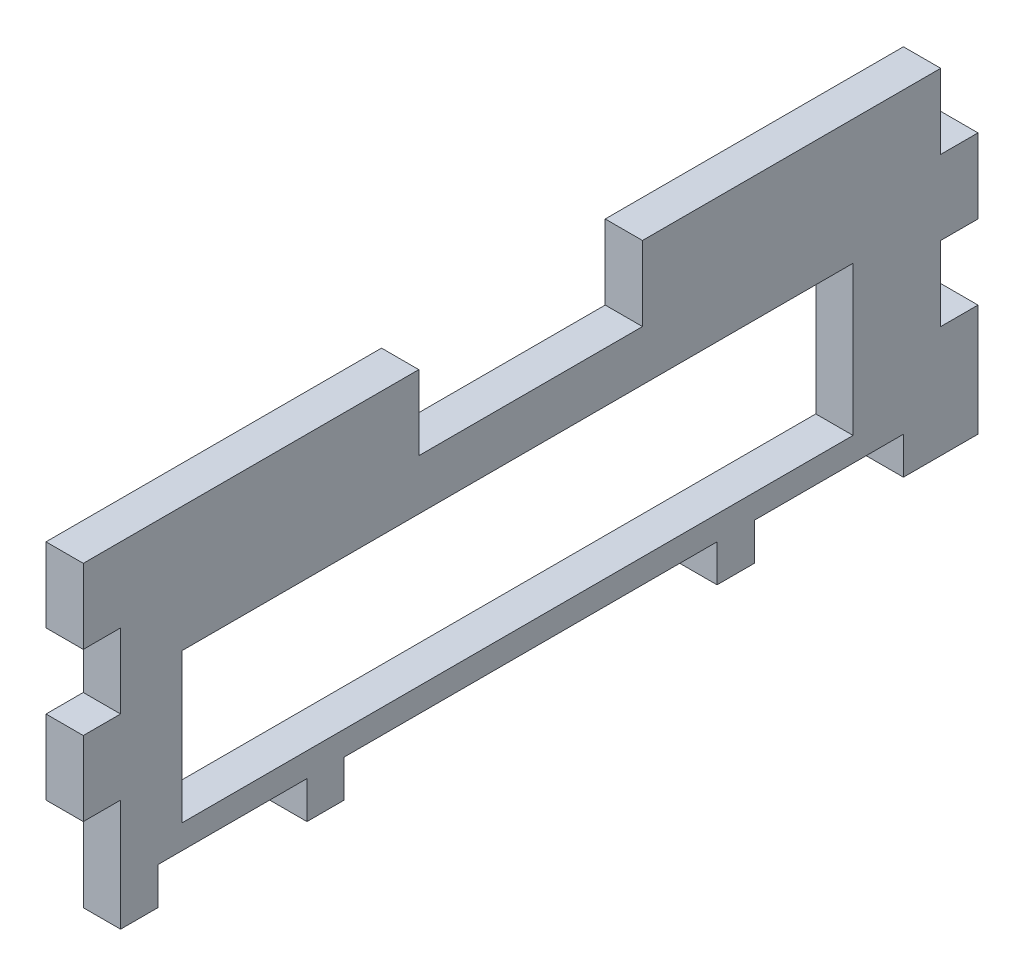
ISO-10303-21;
HEADER;
FILE_DESCRIPTION(('STEP AP214'),'2;1');
FILE_NAME('part.step','',(''),(''),'','','');
FILE_SCHEMA(('AUTOMOTIVE_DESIGN { 1 0 10303 214 1 1 1 1 }'));
ENDSEC;
DATA;
#1=APPLICATION_CONTEXT('core data for automotive mechanical design processes');
#2=APPLICATION_PROTOCOL_DEFINITION('international standard','automotive_design',2000,#1);
#3=PRODUCT_CONTEXT('',#1,'mechanical');
#4=PRODUCT('Part','Part','',(#3));
#5=PRODUCT_RELATED_PRODUCT_CATEGORY('part','',(#4));
#6=PRODUCT_DEFINITION_FORMATION('','',#4);
#7=PRODUCT_DEFINITION_CONTEXT('part definition',#1,'design');
#8=PRODUCT_DEFINITION('design','',#6,#7);
#9=PRODUCT_DEFINITION_SHAPE('','',#8);
#10=(LENGTH_UNIT() NAMED_UNIT(*) SI_UNIT(.MILLI.,.METRE.));
#11=(NAMED_UNIT(*) PLANE_ANGLE_UNIT() SI_UNIT($,.RADIAN.));
#12=(NAMED_UNIT(*) SI_UNIT($,.STERADIAN.) SOLID_ANGLE_UNIT());
#13=UNCERTAINTY_MEASURE_WITH_UNIT(LENGTH_MEASURE(1.E-05),#10,'distance_accuracy_value','');
#14=(GEOMETRIC_REPRESENTATION_CONTEXT(3) GLOBAL_UNCERTAINTY_ASSIGNED_CONTEXT((#13)) GLOBAL_UNIT_ASSIGNED_CONTEXT((#10,
#11,#12)) REPRESENTATION_CONTEXT('',''));
#15=CARTESIAN_POINT('',(0.,0.,0.));
#16=DIRECTION('',(0.,0.,1.));
#17=DIRECTION('',(1.,0.,0.));
#18=AXIS2_PLACEMENT_3D('',#15,#16,#17);
#19=CARTESIAN_POINT('',(6.35,4.10720563576842,0.));
#20=DIRECTION('',(0.,1.,0.));
#21=DIRECTION('',(0.,0.,1.));
#22=AXIS2_PLACEMENT_3D('',#19,#20,#21);
#23=PLANE('',#22);
#24=DIRECTION('',(0.,0.,-1.));
#25=VECTOR('',#24,1.);
#26=CARTESIAN_POINT('',(0.,4.10720563576842,0.));
#27=LINE('',#26,#25);
#28=CARTESIAN_POINT('',(0.,4.10720563576842,59.381703523286));
#29=VERTEX_POINT('',#28);
#30=CARTESIAN_POINT('',(0.,4.10720563576842,-54.918296476714));
#31=VERTEX_POINT('',#30);
#32=EDGE_CURVE('E373',#29,#31,#27,.T.);
#33=ORIENTED_EDGE('',*,*,#32,.T.);
#34=DIRECTION('',(-1.,0.,0.));
#35=VECTOR('',#34,1.);
#36=CARTESIAN_POINT('',(6.35,4.10720563576842,-54.918296476714));
#37=LINE('',#36,#35);
#38=CARTESIAN_POINT('',(6.35,4.10720563576842,-54.918296476714));
#39=VERTEX_POINT('',#38);
#40=EDGE_CURVE('E11',#39,#31,#37,.T.);
#41=ORIENTED_EDGE('',*,*,#40,.F.);
#42=DIRECTION('',(0.,0.,-1.));
#43=VECTOR('',#42,1.);
#44=CARTESIAN_POINT('',(6.35,4.10720563576842,0.));
#45=LINE('',#44,#43);
#46=CARTESIAN_POINT('',(6.35,4.10720563576842,59.381703523286));
#47=VERTEX_POINT('',#46);
#48=EDGE_CURVE('E280',#47,#39,#45,.T.);
#49=ORIENTED_EDGE('',*,*,#48,.F.);
#50=DIRECTION('',(-1.,0.,0.));
#51=VECTOR('',#50,1.);
#52=CARTESIAN_POINT('',(6.35,4.10720563576842,59.381703523286));
#53=LINE('',#52,#51);
#54=EDGE_CURVE('E54',#47,#29,#53,.T.);
#55=ORIENTED_EDGE('',*,*,#54,.T.);
#56=EDGE_LOOP('',(#33,#41,#49,#55));
#57=FACE_BOUND('',#56,.T.);
#58=ADVANCED_FACE('F35',(#57),#23,.F.);
#59=CARTESIAN_POINT('',(6.35,0.,-54.918296476714));
#60=DIRECTION('',(0.,0.,-1.));
#61=DIRECTION('',(-1.,0.,0.));
#62=AXIS2_PLACEMENT_3D('',#59,#60,#61);
#63=PLANE('',#62);
#64=DIRECTION('',(0.,-1.,0.));
#65=VECTOR('',#64,1.);
#66=CARTESIAN_POINT('',(0.,0.,-54.918296476714));
#67=LINE('',#66,#65);
#68=CARTESIAN_POINT('',(0.,-21.2927943642316,-54.918296476714));
#69=VERTEX_POINT('',#68);
#70=EDGE_CURVE('E286',#31,#69,#67,.T.);
#71=ORIENTED_EDGE('',*,*,#70,.T.);
#72=DIRECTION('',(-1.,0.,0.));
#73=VECTOR('',#72,1.);
#74=CARTESIAN_POINT('',(6.35,-21.2927943642316,-54.918296476714));
#75=LINE('',#74,#73);
#76=CARTESIAN_POINT('',(6.35,-21.2927943642316,-54.918296476714));
#77=VERTEX_POINT('',#76);
#78=EDGE_CURVE('E45',#77,#69,#75,.T.);
#79=ORIENTED_EDGE('',*,*,#78,.F.);
#80=DIRECTION('',(0.,-1.,0.));
#81=VECTOR('',#80,1.);
#82=CARTESIAN_POINT('',(6.35,0.,-54.918296476714));
#83=LINE('',#82,#81);
#84=EDGE_CURVE('E274',#39,#77,#83,.T.);
#85=ORIENTED_EDGE('',*,*,#84,.F.);
#86=ORIENTED_EDGE('',*,*,#40,.T.);
#87=EDGE_LOOP('',(#71,#79,#85,#86));
#88=FACE_BOUND('',#87,.T.);
#89=ADVANCED_FACE('F285',(#88),#63,.F.);
#90=CARTESIAN_POINT('',(6.35,-21.2927943642316,0.));
#91=DIRECTION('',(0.,1.,0.));
#92=DIRECTION('',(0.,0.,1.));
#93=AXIS2_PLACEMENT_3D('',#90,#91,#92);
#94=PLANE('',#93);
#95=DIRECTION('',(0.,0.,-1.));
#96=VECTOR('',#95,1.);
#97=CARTESIAN_POINT('',(0.,-21.2927943642316,0.));
#98=LINE('',#97,#96);
#99=CARTESIAN_POINT('',(0.,-21.2927943642316,59.381703523286));
#100=VERTEX_POINT('',#99);
#101=EDGE_CURVE('E376',#100,#69,#98,.T.);
#102=ORIENTED_EDGE('',*,*,#101,.F.);
#103=DIRECTION('',(-1.,0.,0.));
#104=VECTOR('',#103,1.);
#105=CARTESIAN_POINT('',(6.35,-21.2927943642316,59.381703523286));
#106=LINE('',#105,#104);
#107=CARTESIAN_POINT('',(6.35,-21.2927943642316,59.381703523286));
#108=VERTEX_POINT('',#107);
#109=EDGE_CURVE('E162',#108,#100,#106,.T.);
#110=ORIENTED_EDGE('',*,*,#109,.F.);
#111=DIRECTION('',(0.,0.,-1.));
#112=VECTOR('',#111,1.);
#113=CARTESIAN_POINT('',(6.35,-21.2927943642316,0.));
#114=LINE('',#113,#112);
#115=EDGE_CURVE('E279',#108,#77,#114,.T.);
#116=ORIENTED_EDGE('',*,*,#115,.T.);
#117=ORIENTED_EDGE('',*,*,#78,.T.);
#118=EDGE_LOOP('',(#102,#110,#116,#117));
#119=FACE_BOUND('',#118,.T.);
#120=ADVANCED_FACE('F290',(#119),#94,.T.);
#121=CARTESIAN_POINT('',(6.35,25.4,0.));
#122=DIRECTION('',(0.,1.,0.));
#123=DIRECTION('',(0.,0.,1.));
#124=AXIS2_PLACEMENT_3D('',#121,#122,#123);
#125=PLANE('',#124);
#126=DIRECTION('',(0.,0.,-1.));
#127=VECTOR('',#126,1.);
#128=CARTESIAN_POINT('',(0.,25.4,0.));
#129=LINE('',#128,#127);
#130=CARTESIAN_POINT('',(0.,25.4,-19.05));
#131=VERTEX_POINT('',#130);
#132=CARTESIAN_POINT('',(0.,25.4,-69.85));
#133=VERTEX_POINT('',#132);
#134=EDGE_CURVE('E297',#131,#133,#129,.T.);
#135=ORIENTED_EDGE('',*,*,#134,.F.);
#136=DIRECTION('',(-1.,0.,0.));
#137=VECTOR('',#136,1.);
#138=CARTESIAN_POINT('',(6.35,25.4,-19.05));
#139=LINE('',#138,#137);
#140=CARTESIAN_POINT('',(6.35,25.4,-19.05));
#141=VERTEX_POINT('',#140);
#142=EDGE_CURVE('E39',#141,#131,#139,.T.);
#143=ORIENTED_EDGE('',*,*,#142,.F.);
#144=DIRECTION('',(0.,0.,-1.));
#145=VECTOR('',#144,1.);
#146=CARTESIAN_POINT('',(6.35,25.4,0.));
#147=LINE('',#146,#145);
#148=CARTESIAN_POINT('',(6.35,25.4,-69.85));
#149=VERTEX_POINT('',#148);
#150=EDGE_CURVE('E381',#141,#149,#147,.T.);
#151=ORIENTED_EDGE('',*,*,#150,.T.);
#152=DIRECTION('',(-1.,0.,0.));
#153=VECTOR('',#152,1.);
#154=CARTESIAN_POINT('',(6.35,25.4,-69.85));
#155=LINE('',#154,#153);
#156=EDGE_CURVE('E293',#149,#133,#155,.T.);
#157=ORIENTED_EDGE('',*,*,#156,.T.);
#158=EDGE_LOOP('',(#135,#143,#151,#157));
#159=FACE_BOUND('',#158,.T.);
#160=ADVANCED_FACE('F467',(#159),#125,.T.);
#161=CARTESIAN_POINT('',(6.35,0.,-19.05));
#162=DIRECTION('',(0.,0.,-1.));
#163=DIRECTION('',(0.,1.,0.));
#164=AXIS2_PLACEMENT_3D('',#161,#162,#163);
#165=PLANE('',#164);
#166=DIRECTION('',(0.,-1.,0.));
#167=VECTOR('',#166,1.);
#168=CARTESIAN_POINT('',(0.,0.,-19.05));
#169=LINE('',#168,#167);
#170=CARTESIAN_POINT('',(0.,12.7,-19.05));
#171=VERTEX_POINT('',#170);
#172=EDGE_CURVE('E300',#131,#171,#169,.T.);
#173=ORIENTED_EDGE('',*,*,#172,.T.);
#174=DIRECTION('',(-1.,0.,0.));
#175=VECTOR('',#174,1.);
#176=CARTESIAN_POINT('',(6.35,12.7,-19.05));
#177=LINE('',#176,#175);
#178=CARTESIAN_POINT('',(6.35,12.7,-19.05));
#179=VERTEX_POINT('',#178);
#180=EDGE_CURVE('E452',#179,#171,#177,.T.);
#181=ORIENTED_EDGE('',*,*,#180,.F.);
#182=DIRECTION('',(0.,-1.,0.));
#183=VECTOR('',#182,1.);
#184=CARTESIAN_POINT('',(6.35,0.,-19.05));
#185=LINE('',#184,#183);
#186=EDGE_CURVE('E459',#141,#179,#185,.T.);
#187=ORIENTED_EDGE('',*,*,#186,.F.);
#188=ORIENTED_EDGE('',*,*,#142,.T.);
#189=EDGE_LOOP('',(#173,#181,#187,#188));
#190=FACE_BOUND('',#189,.T.);
#191=ADVANCED_FACE('F37',(#190),#165,.F.);
#192=CARTESIAN_POINT('',(6.35,12.7,0.));
#193=DIRECTION('',(0.,1.,0.));
#194=DIRECTION('',(0.,0.,1.));
#195=AXIS2_PLACEMENT_3D('',#192,#193,#194);
#196=PLANE('',#195);
#197=DIRECTION('',(0.,0.,-1.));
#198=VECTOR('',#197,1.);
#199=CARTESIAN_POINT('',(0.,12.7,0.));
#200=LINE('',#199,#198);
#201=CARTESIAN_POINT('',(0.,12.7,19.05));
#202=VERTEX_POINT('',#201);
#203=EDGE_CURVE('E305',#202,#171,#200,.T.);
#204=ORIENTED_EDGE('',*,*,#203,.F.);
#205=DIRECTION('',(-1.,0.,0.));
#206=VECTOR('',#205,1.);
#207=CARTESIAN_POINT('',(6.35,12.7,19.05));
#208=LINE('',#207,#206);
#209=CARTESIAN_POINT('',(6.35,12.7,19.05));
#210=VERTEX_POINT('',#209);
#211=EDGE_CURVE('E451',#210,#202,#208,.T.);
#212=ORIENTED_EDGE('',*,*,#211,.F.);
#213=DIRECTION('',(0.,0.,-1.));
#214=VECTOR('',#213,1.);
#215=CARTESIAN_POINT('',(6.35,12.7,0.));
#216=LINE('',#215,#214);
#217=EDGE_CURVE('E521',#210,#179,#216,.T.);
#218=ORIENTED_EDGE('',*,*,#217,.T.);
#219=ORIENTED_EDGE('',*,*,#180,.T.);
#220=EDGE_LOOP('',(#204,#212,#218,#219));
#221=FACE_BOUND('',#220,.T.);
#222=ADVANCED_FACE('F675',(#221),#196,.T.);
#223=CARTESIAN_POINT('',(6.35,0.,19.05));
#224=DIRECTION('',(0.,0.,-1.));
#225=DIRECTION('',(-1.,0.,0.));
#226=AXIS2_PLACEMENT_3D('',#223,#224,#225);
#227=PLANE('',#226);
#228=DIRECTION('',(0.,-1.,0.));
#229=VECTOR('',#228,1.);
#230=CARTESIAN_POINT('',(0.,0.,19.05));
#231=LINE('',#230,#229);
#232=CARTESIAN_POINT('',(0.,25.4,19.05));
#233=VERTEX_POINT('',#232);
#234=EDGE_CURVE('E308',#233,#202,#231,.T.);
#235=ORIENTED_EDGE('',*,*,#234,.F.);
#236=DIRECTION('',(-1.,0.,0.));
#237=VECTOR('',#236,1.);
#238=CARTESIAN_POINT('',(6.35,25.4,19.05));
#239=LINE('',#238,#237);
#240=CARTESIAN_POINT('',(6.35,25.4,19.05));
#241=VERTEX_POINT('',#240);
#242=EDGE_CURVE('E449',#241,#233,#239,.T.);
#243=ORIENTED_EDGE('',*,*,#242,.F.);
#244=DIRECTION('',(0.,-1.,0.));
#245=VECTOR('',#244,1.);
#246=CARTESIAN_POINT('',(6.35,0.,19.05));
#247=LINE('',#246,#245);
#248=EDGE_CURVE('E523',#241,#210,#247,.T.);
#249=ORIENTED_EDGE('',*,*,#248,.T.);
#250=ORIENTED_EDGE('',*,*,#211,.T.);
#251=EDGE_LOOP('',(#235,#243,#249,#250));
#252=FACE_BOUND('',#251,.T.);
#253=ADVANCED_FACE('F672',(#252),#227,.T.);
#254=CARTESIAN_POINT('',(0.,25.4,76.2));
#255=VERTEX_POINT('',#254);
#256=EDGE_CURVE('E302',#255,#233,#129,.T.);
#257=ORIENTED_EDGE('',*,*,#256,.F.);
#258=DIRECTION('',(-1.,0.,0.));
#259=VECTOR('',#258,1.);
#260=CARTESIAN_POINT('',(6.35,25.4,76.2));
#261=LINE('',#260,#259);
#262=CARTESIAN_POINT('',(6.35,25.4,76.2));
#263=VERTEX_POINT('',#262);
#264=EDGE_CURVE('E447',#263,#255,#261,.T.);
#265=ORIENTED_EDGE('',*,*,#264,.F.);
#266=EDGE_CURVE('E519',#263,#241,#147,.T.);
#267=ORIENTED_EDGE('',*,*,#266,.T.);
#268=ORIENTED_EDGE('',*,*,#242,.T.);
#269=EDGE_LOOP('',(#257,#265,#267,#268));
#270=FACE_BOUND('',#269,.T.);
#271=ADVANCED_FACE('F669',(#270),#125,.T.);
#272=CARTESIAN_POINT('',(6.35,0.,76.2));
#273=DIRECTION('',(0.,0.,1.));
#274=DIRECTION('',(1.,0.,0.));
#275=AXIS2_PLACEMENT_3D('',#272,#273,#274);
#276=PLANE('',#275);
#277=DIRECTION('',(0.,1.,0.));
#278=VECTOR('',#277,1.);
#279=CARTESIAN_POINT('',(0.,0.,76.2));
#280=LINE('',#279,#278);
#281=CARTESIAN_POINT('',(0.,12.7,76.2));
#282=VERTEX_POINT('',#281);
#283=EDGE_CURVE('E311',#282,#255,#280,.T.);
#284=ORIENTED_EDGE('',*,*,#283,.F.);
#285=DIRECTION('',(-1.,0.,0.));
#286=VECTOR('',#285,1.);
#287=CARTESIAN_POINT('',(6.35,12.7,76.2));
#288=LINE('',#287,#286);
#289=CARTESIAN_POINT('',(6.35,12.7,76.2));
#290=VERTEX_POINT('',#289);
#291=EDGE_CURVE('E445',#290,#282,#288,.T.);
#292=ORIENTED_EDGE('',*,*,#291,.F.);
#293=DIRECTION('',(0.,1.,0.));
#294=VECTOR('',#293,1.);
#295=CARTESIAN_POINT('',(6.35,0.,76.2));
#296=LINE('',#295,#294);
#297=EDGE_CURVE('E526',#290,#263,#296,.T.);
#298=ORIENTED_EDGE('',*,*,#297,.T.);
#299=ORIENTED_EDGE('',*,*,#264,.T.);
#300=EDGE_LOOP('',(#284,#292,#298,#299));
#301=FACE_BOUND('',#300,.T.);
#302=ADVANCED_FACE('F664',(#301),#276,.T.);
#303=CARTESIAN_POINT('',(6.35,12.7,0.));
#304=DIRECTION('',(0.,1.,0.));
#305=DIRECTION('',(0.,0.,1.));
#306=AXIS2_PLACEMENT_3D('',#303,#304,#305);
#307=PLANE('',#306);
#308=DIRECTION('',(0.,0.,-1.));
#309=VECTOR('',#308,1.);
#310=CARTESIAN_POINT('',(0.,12.7,0.));
#311=LINE('',#310,#309);
#312=CARTESIAN_POINT('',(0.,12.7,69.85));
#313=VERTEX_POINT('',#312);
#314=EDGE_CURVE('E314',#282,#313,#311,.T.);
#315=ORIENTED_EDGE('',*,*,#314,.T.);
#316=DIRECTION('',(-1.,0.,0.));
#317=VECTOR('',#316,1.);
#318=CARTESIAN_POINT('',(6.35,12.7,69.85));
#319=LINE('',#318,#317);
#320=CARTESIAN_POINT('',(6.35,12.7,69.85));
#321=VERTEX_POINT('',#320);
#322=EDGE_CURVE('E442',#321,#313,#319,.T.);
#323=ORIENTED_EDGE('',*,*,#322,.F.);
#324=DIRECTION('',(0.,0.,-1.));
#325=VECTOR('',#324,1.);
#326=CARTESIAN_POINT('',(6.35,12.7,0.));
#327=LINE('',#326,#325);
#328=EDGE_CURVE('E529',#290,#321,#327,.T.);
#329=ORIENTED_EDGE('',*,*,#328,.F.);
#330=ORIENTED_EDGE('',*,*,#291,.T.);
#331=EDGE_LOOP('',(#315,#323,#329,#330));
#332=FACE_BOUND('',#331,.T.);
#333=ADVANCED_FACE('F659',(#332),#307,.F.);
#334=CARTESIAN_POINT('',(6.35,0.,69.85));
#335=DIRECTION('',(0.,0.,-1.));
#336=DIRECTION('',(-1.,0.,0.));
#337=AXIS2_PLACEMENT_3D('',#334,#335,#336);
#338=PLANE('',#337);
#339=DIRECTION('',(0.,-1.,0.));
#340=VECTOR('',#339,1.);
#341=CARTESIAN_POINT('',(0.,0.,69.85));
#342=LINE('',#341,#340);
#343=CARTESIAN_POINT('',(0.,0.,69.85));
#344=VERTEX_POINT('',#343);
#345=EDGE_CURVE('E317',#313,#344,#342,.T.);
#346=ORIENTED_EDGE('',*,*,#345,.T.);
#347=DIRECTION('',(-1.,0.,0.));
#348=VECTOR('',#347,1.);
#349=CARTESIAN_POINT('',(6.35,0.,69.85));
#350=LINE('',#349,#348);
#351=CARTESIAN_POINT('',(6.35,0.,69.85));
#352=VERTEX_POINT('',#351);
#353=EDGE_CURVE('E439',#352,#344,#350,.T.);
#354=ORIENTED_EDGE('',*,*,#353,.F.);
#355=DIRECTION('',(0.,-1.,0.));
#356=VECTOR('',#355,1.);
#357=CARTESIAN_POINT('',(6.35,0.,69.85));
#358=LINE('',#357,#356);
#359=EDGE_CURVE('E532',#321,#352,#358,.T.);
#360=ORIENTED_EDGE('',*,*,#359,.F.);
#361=ORIENTED_EDGE('',*,*,#322,.T.);
#362=EDGE_LOOP('',(#346,#354,#360,#361));
#363=FACE_BOUND('',#362,.T.);
#364=ADVANCED_FACE('F655',(#363),#338,.F.);
#365=CARTESIAN_POINT('',(6.35,0.,0.));
#366=DIRECTION('',(0.,-1.,0.));
#367=DIRECTION('',(0.,0.,-1.));
#368=AXIS2_PLACEMENT_3D('',#365,#366,#367);
#369=PLANE('',#368);
#370=DIRECTION('',(0.,0.,1.));
#371=VECTOR('',#370,1.);
#372=CARTESIAN_POINT('',(0.,0.,0.));
#373=LINE('',#372,#371);
#374=CARTESIAN_POINT('',(0.,0.,76.2));
#375=VERTEX_POINT('',#374);
#376=EDGE_CURVE('E319',#344,#375,#373,.T.);
#377=ORIENTED_EDGE('',*,*,#376,.T.);
#378=DIRECTION('',(-1.,0.,0.));
#379=VECTOR('',#378,1.);
#380=CARTESIAN_POINT('',(6.35,0.,76.2));
#381=LINE('',#380,#379);
#382=CARTESIAN_POINT('',(6.35,0.,76.2));
#383=VERTEX_POINT('',#382);
#384=EDGE_CURVE('E437',#383,#375,#381,.T.);
#385=ORIENTED_EDGE('',*,*,#384,.F.);
#386=DIRECTION('',(0.,0.,1.));
#387=VECTOR('',#386,1.);
#388=CARTESIAN_POINT('',(6.35,0.,0.));
#389=LINE('',#388,#387);
#390=EDGE_CURVE('E534',#352,#383,#389,.T.);
#391=ORIENTED_EDGE('',*,*,#390,.F.);
#392=ORIENTED_EDGE('',*,*,#353,.T.);
#393=EDGE_LOOP('',(#377,#385,#391,#392));
#394=FACE_BOUND('',#393,.T.);
#395=ADVANCED_FACE('F650',(#394),#369,.F.);
#396=CARTESIAN_POINT('',(0.,-12.7,76.2));
#397=VERTEX_POINT('',#396);
#398=EDGE_CURVE('E315',#397,#375,#280,.T.);
#399=ORIENTED_EDGE('',*,*,#398,.F.);
#400=DIRECTION('',(-1.,0.,0.));
#401=VECTOR('',#400,1.);
#402=CARTESIAN_POINT('',(6.35,-12.7,76.2));
#403=LINE('',#402,#401);
#404=CARTESIAN_POINT('',(6.35,-12.7,76.2));
#405=VERTEX_POINT('',#404);
#406=EDGE_CURVE('E435',#405,#397,#403,.T.);
#407=ORIENTED_EDGE('',*,*,#406,.F.);
#408=EDGE_CURVE('E530',#405,#383,#296,.T.);
#409=ORIENTED_EDGE('',*,*,#408,.T.);
#410=ORIENTED_EDGE('',*,*,#384,.T.);
#411=EDGE_LOOP('',(#399,#407,#409,#410));
#412=FACE_BOUND('',#411,.T.);
#413=ADVANCED_FACE('F644',(#412),#276,.T.);
#414=CARTESIAN_POINT('',(6.35,-12.7,0.));
#415=DIRECTION('',(0.,1.,0.));
#416=DIRECTION('',(0.,0.,1.));
#417=AXIS2_PLACEMENT_3D('',#414,#415,#416);
#418=PLANE('',#417);
#419=DIRECTION('',(0.,0.,-1.));
#420=VECTOR('',#419,1.);
#421=CARTESIAN_POINT('',(0.,-12.7,0.));
#422=LINE('',#421,#420);
#423=CARTESIAN_POINT('',(0.,-12.7,69.85));
#424=VERTEX_POINT('',#423);
#425=EDGE_CURVE('E322',#397,#424,#422,.T.);
#426=ORIENTED_EDGE('',*,*,#425,.T.);
#427=DIRECTION('',(-1.,0.,0.));
#428=VECTOR('',#427,1.);
#429=CARTESIAN_POINT('',(6.35,-12.7,69.85));
#430=LINE('',#429,#428);
#431=CARTESIAN_POINT('',(6.35,-12.7,69.85));
#432=VERTEX_POINT('',#431);
#433=EDGE_CURVE('E432',#432,#424,#430,.T.);
#434=ORIENTED_EDGE('',*,*,#433,.F.);
#435=DIRECTION('',(0.,0.,-1.));
#436=VECTOR('',#435,1.);
#437=CARTESIAN_POINT('',(6.35,-12.7,0.));
#438=LINE('',#437,#436);
#439=EDGE_CURVE('E536',#405,#432,#438,.T.);
#440=ORIENTED_EDGE('',*,*,#439,.F.);
#441=ORIENTED_EDGE('',*,*,#406,.T.);
#442=EDGE_LOOP('',(#426,#434,#440,#441));
#443=FACE_BOUND('',#442,.T.);
#444=ADVANCED_FACE('F640',(#443),#418,.F.);
#445=CARTESIAN_POINT('',(6.35,0.,69.85));
#446=DIRECTION('',(0.,0.,-1.));
#447=DIRECTION('',(0.,1.,0.));
#448=AXIS2_PLACEMENT_3D('',#445,#446,#447);
#449=PLANE('',#448);
#450=DIRECTION('',(0.,-1.,0.));
#451=VECTOR('',#450,1.);
#452=CARTESIAN_POINT('',(0.,0.,69.85));
#453=LINE('',#452,#451);
#454=CARTESIAN_POINT('',(0.,-31.75,69.85));
#455=VERTEX_POINT('',#454);
#456=EDGE_CURVE('E324',#424,#455,#453,.T.);
#457=ORIENTED_EDGE('',*,*,#456,.T.);
#458=DIRECTION('',(-1.,0.,0.));
#459=VECTOR('',#458,1.);
#460=CARTESIAN_POINT('',(6.35,-31.75,69.85));
#461=LINE('',#460,#459);
#462=CARTESIAN_POINT('',(6.35,-31.75,69.85));
#463=VERTEX_POINT('',#462);
#464=EDGE_CURVE('E429',#463,#455,#461,.T.);
#465=ORIENTED_EDGE('',*,*,#464,.F.);
#466=DIRECTION('',(0.,-1.,0.));
#467=VECTOR('',#466,1.);
#468=CARTESIAN_POINT('',(6.35,0.,69.85));
#469=LINE('',#468,#467);
#470=EDGE_CURVE('E538',#432,#463,#469,.T.);
#471=ORIENTED_EDGE('',*,*,#470,.F.);
#472=ORIENTED_EDGE('',*,*,#433,.T.);
#473=EDGE_LOOP('',(#457,#465,#471,#472));
#474=FACE_BOUND('',#473,.T.);
#475=ADVANCED_FACE('F635',(#474),#449,.F.);
#476=CARTESIAN_POINT('',(6.35,-31.75,0.));
#477=DIRECTION('',(0.,1.,0.));
#478=DIRECTION('',(0.,0.,1.));
#479=AXIS2_PLACEMENT_3D('',#476,#477,#478);
#480=PLANE('',#479);
#481=DIRECTION('',(0.,0.,-1.));
#482=VECTOR('',#481,1.);
#483=CARTESIAN_POINT('',(0.,-31.75,0.));
#484=LINE('',#483,#482);
#485=CARTESIAN_POINT('',(0.,-31.75,63.5));
#486=VERTEX_POINT('',#485);
#487=EDGE_CURVE('E326',#455,#486,#484,.T.);
#488=ORIENTED_EDGE('',*,*,#487,.T.);
#489=DIRECTION('',(-1.,0.,0.));
#490=VECTOR('',#489,1.);
#491=CARTESIAN_POINT('',(6.35,-31.75,63.5));
#492=LINE('',#491,#490);
#493=CARTESIAN_POINT('',(6.35,-31.75,63.5));
#494=VERTEX_POINT('',#493);
#495=EDGE_CURVE('E427',#494,#486,#492,.T.);
#496=ORIENTED_EDGE('',*,*,#495,.F.);
#497=DIRECTION('',(0.,0.,-1.));
#498=VECTOR('',#497,1.);
#499=CARTESIAN_POINT('',(6.35,-31.75,0.));
#500=LINE('',#499,#498);
#501=EDGE_CURVE('E540',#463,#494,#500,.T.);
#502=ORIENTED_EDGE('',*,*,#501,.F.);
#503=ORIENTED_EDGE('',*,*,#464,.T.);
#504=EDGE_LOOP('',(#488,#496,#502,#503));
#505=FACE_BOUND('',#504,.T.);
#506=ADVANCED_FACE('F628',(#505),#480,.F.);
#507=CARTESIAN_POINT('',(6.35,0.,63.5));
#508=DIRECTION('',(0.,0.,-1.));
#509=DIRECTION('',(-1.,0.,0.));
#510=AXIS2_PLACEMENT_3D('',#507,#508,#509);
#511=PLANE('',#510);
#512=DIRECTION('',(0.,-1.,0.));
#513=VECTOR('',#512,1.);
#514=CARTESIAN_POINT('',(0.,0.,63.5));
#515=LINE('',#514,#513);
#516=CARTESIAN_POINT('',(0.,-25.4,63.5));
#517=VERTEX_POINT('',#516);
#518=EDGE_CURVE('E329',#517,#486,#515,.T.);
#519=ORIENTED_EDGE('',*,*,#518,.F.);
#520=DIRECTION('',(-1.,0.,0.));
#521=VECTOR('',#520,1.);
#522=CARTESIAN_POINT('',(6.35,-25.4,63.5));
#523=LINE('',#522,#521);
#524=CARTESIAN_POINT('',(6.35,-25.4,63.5));
#525=VERTEX_POINT('',#524);
#526=EDGE_CURVE('E425',#525,#517,#523,.T.);
#527=ORIENTED_EDGE('',*,*,#526,.F.);
#528=DIRECTION('',(0.,-1.,0.));
#529=VECTOR('',#528,1.);
#530=CARTESIAN_POINT('',(6.35,0.,63.5));
#531=LINE('',#530,#529);
#532=EDGE_CURVE('E542',#525,#494,#531,.T.);
#533=ORIENTED_EDGE('',*,*,#532,.T.);
#534=ORIENTED_EDGE('',*,*,#495,.T.);
#535=EDGE_LOOP('',(#519,#527,#533,#534));
#536=FACE_BOUND('',#535,.T.);
#537=ADVANCED_FACE('F624',(#536),#511,.T.);
#538=CARTESIAN_POINT('',(6.35,-25.4,0.));
#539=DIRECTION('',(0.,1.,0.));
#540=DIRECTION('',(0.,0.,1.));
#541=AXIS2_PLACEMENT_3D('',#538,#539,#540);
#542=PLANE('',#541);
#543=DIRECTION('',(0.,0.,-1.));
#544=VECTOR('',#543,1.);
#545=CARTESIAN_POINT('',(0.,-25.4,0.));
#546=LINE('',#545,#544);
#547=CARTESIAN_POINT('',(0.,-25.4,38.1));
#548=VERTEX_POINT('',#547);
#549=EDGE_CURVE('E332',#517,#548,#546,.T.);
#550=ORIENTED_EDGE('',*,*,#549,.T.);
#551=DIRECTION('',(-1.,0.,0.));
#552=VECTOR('',#551,1.);
#553=CARTESIAN_POINT('',(6.35,-25.4,38.1));
#554=LINE('',#553,#552);
#555=CARTESIAN_POINT('',(6.35,-25.4,38.1));
#556=VERTEX_POINT('',#555);
#557=EDGE_CURVE('E422',#556,#548,#554,.T.);
#558=ORIENTED_EDGE('',*,*,#557,.F.);
#559=DIRECTION('',(0.,0.,-1.));
#560=VECTOR('',#559,1.);
#561=CARTESIAN_POINT('',(6.35,-25.4,0.));
#562=LINE('',#561,#560);
#563=EDGE_CURVE('E545',#525,#556,#562,.T.);
#564=ORIENTED_EDGE('',*,*,#563,.F.);
#565=ORIENTED_EDGE('',*,*,#526,.T.);
#566=EDGE_LOOP('',(#550,#558,#564,#565));
#567=FACE_BOUND('',#566,.T.);
#568=ADVANCED_FACE('F619',(#567),#542,.F.);
#569=CARTESIAN_POINT('',(6.35,0.,38.1));
#570=DIRECTION('',(0.,0.,-1.));
#571=DIRECTION('',(0.,1.,0.));
#572=AXIS2_PLACEMENT_3D('',#569,#570,#571);
#573=PLANE('',#572);
#574=DIRECTION('',(0.,-1.,0.));
#575=VECTOR('',#574,1.);
#576=CARTESIAN_POINT('',(0.,0.,38.1));
#577=LINE('',#576,#575);
#578=CARTESIAN_POINT('',(0.,-31.7499999999999,38.1));
#579=VERTEX_POINT('',#578);
#580=EDGE_CURVE('E334',#548,#579,#577,.T.);
#581=ORIENTED_EDGE('',*,*,#580,.T.);
#582=DIRECTION('',(-1.,0.,0.));
#583=VECTOR('',#582,1.);
#584=CARTESIAN_POINT('',(6.35,-31.7499999999999,38.1));
#585=LINE('',#584,#583);
#586=CARTESIAN_POINT('',(6.35,-31.7499999999999,38.1));
#587=VERTEX_POINT('',#586);
#588=EDGE_CURVE('E419',#587,#579,#585,.T.);
#589=ORIENTED_EDGE('',*,*,#588,.F.);
#590=DIRECTION('',(0.,-1.,0.));
#591=VECTOR('',#590,1.);
#592=CARTESIAN_POINT('',(6.35,0.,38.1));
#593=LINE('',#592,#591);
#594=EDGE_CURVE('E547',#556,#587,#593,.T.);
#595=ORIENTED_EDGE('',*,*,#594,.F.);
#596=ORIENTED_EDGE('',*,*,#557,.T.);
#597=EDGE_LOOP('',(#581,#589,#595,#596));
#598=FACE_BOUND('',#597,.T.);
#599=ADVANCED_FACE('F615',(#598),#573,.F.);
#600=CARTESIAN_POINT('',(6.35,-31.7499999999999,0.));
#601=DIRECTION('',(0.,1.,0.));
#602=DIRECTION('',(0.,0.,1.));
#603=AXIS2_PLACEMENT_3D('',#600,#601,#602);
#604=PLANE('',#603);
#605=DIRECTION('',(0.,0.,-1.));
#606=VECTOR('',#605,1.);
#607=CARTESIAN_POINT('',(0.,-31.7499999999999,0.));
#608=LINE('',#607,#606);
#609=CARTESIAN_POINT('',(0.,-31.7499999999999,31.75));
#610=VERTEX_POINT('',#609);
#611=EDGE_CURVE('E338',#579,#610,#608,.T.);
#612=ORIENTED_EDGE('',*,*,#611,.T.);
#613=DIRECTION('',(-1.,0.,0.));
#614=VECTOR('',#613,1.);
#615=CARTESIAN_POINT('',(6.35,-31.7499999999999,31.75));
#616=LINE('',#615,#614);
#617=CARTESIAN_POINT('',(6.35,-31.7499999999999,31.75));
#618=VERTEX_POINT('',#617);
#619=EDGE_CURVE('E416',#618,#610,#616,.T.);
#620=ORIENTED_EDGE('',*,*,#619,.F.);
#621=DIRECTION('',(0.,0.,-1.));
#622=VECTOR('',#621,1.);
#623=CARTESIAN_POINT('',(6.35,-31.7499999999999,0.));
#624=LINE('',#623,#622);
#625=EDGE_CURVE('E551',#587,#618,#624,.T.);
#626=ORIENTED_EDGE('',*,*,#625,.F.);
#627=ORIENTED_EDGE('',*,*,#588,.T.);
#628=EDGE_LOOP('',(#612,#620,#626,#627));
#629=FACE_BOUND('',#628,.T.);
#630=ADVANCED_FACE('F610',(#629),#604,.F.);
#631=CARTESIAN_POINT('',(6.35,0.,31.75));
#632=DIRECTION('',(0.,0.,1.));
#633=DIRECTION('',(1.,0.,0.));
#634=AXIS2_PLACEMENT_3D('',#631,#632,#633);
#635=PLANE('',#634);
#636=DIRECTION('',(0.,1.,0.));
#637=VECTOR('',#636,1.);
#638=CARTESIAN_POINT('',(0.,0.,31.75));
#639=LINE('',#638,#637);
#640=CARTESIAN_POINT('',(0.,-25.4,31.75));
#641=VERTEX_POINT('',#640);
#642=EDGE_CURVE('E340',#610,#641,#639,.T.);
#643=ORIENTED_EDGE('',*,*,#642,.T.);
#644=DIRECTION('',(-1.,0.,0.));
#645=VECTOR('',#644,1.);
#646=CARTESIAN_POINT('',(6.35,-25.4,31.75));
#647=LINE('',#646,#645);
#648=CARTESIAN_POINT('',(6.35,-25.4,31.75));
#649=VERTEX_POINT('',#648);
#650=EDGE_CURVE('E413',#649,#641,#647,.T.);
#651=ORIENTED_EDGE('',*,*,#650,.F.);
#652=DIRECTION('',(0.,1.,0.));
#653=VECTOR('',#652,1.);
#654=CARTESIAN_POINT('',(6.35,0.,31.75));
#655=LINE('',#654,#653);
#656=EDGE_CURVE('E553',#618,#649,#655,.T.);
#657=ORIENTED_EDGE('',*,*,#656,.F.);
#658=ORIENTED_EDGE('',*,*,#619,.T.);
#659=EDGE_LOOP('',(#643,#651,#657,#658));
#660=FACE_BOUND('',#659,.T.);
#661=ADVANCED_FACE('F604',(#660),#635,.F.);
#662=CARTESIAN_POINT('',(0.,-25.4,-31.75));
#663=VERTEX_POINT('',#662);
#664=EDGE_CURVE('E336',#641,#663,#546,.T.);
#665=ORIENTED_EDGE('',*,*,#664,.T.);
#666=DIRECTION('',(-1.,0.,0.));
#667=VECTOR('',#666,1.);
#668=CARTESIAN_POINT('',(6.35,-25.4,-31.75));
#669=LINE('',#668,#667);
#670=CARTESIAN_POINT('',(6.35,-25.4,-31.75));
#671=VERTEX_POINT('',#670);
#672=EDGE_CURVE('E411',#671,#663,#669,.T.);
#673=ORIENTED_EDGE('',*,*,#672,.F.);
#674=EDGE_CURVE('E549',#649,#671,#562,.T.);
#675=ORIENTED_EDGE('',*,*,#674,.F.);
#676=ORIENTED_EDGE('',*,*,#650,.T.);
#677=EDGE_LOOP('',(#665,#673,#675,#676));
#678=FACE_BOUND('',#677,.T.);
#679=ADVANCED_FACE('F600',(#678),#542,.F.);
#680=CARTESIAN_POINT('',(6.35,0.,-31.75));
#681=DIRECTION('',(0.,0.,1.));
#682=DIRECTION('',(1.,0.,0.));
#683=AXIS2_PLACEMENT_3D('',#680,#681,#682);
#684=PLANE('',#683);
#685=DIRECTION('',(0.,1.,0.));
#686=VECTOR('',#685,1.);
#687=CARTESIAN_POINT('',(0.,0.,-31.75));
#688=LINE('',#687,#686);
#689=CARTESIAN_POINT('',(0.,-31.7499999999999,-31.75));
#690=VERTEX_POINT('',#689);
#691=EDGE_CURVE('E342',#690,#663,#688,.T.);
#692=ORIENTED_EDGE('',*,*,#691,.F.);
#693=DIRECTION('',(-1.,0.,0.));
#694=VECTOR('',#693,1.);
#695=CARTESIAN_POINT('',(6.35,-31.7499999999999,-31.75));
#696=LINE('',#695,#694);
#697=CARTESIAN_POINT('',(6.35,-31.7499999999999,-31.75));
#698=VERTEX_POINT('',#697);
#699=EDGE_CURVE('E409',#698,#690,#696,.T.);
#700=ORIENTED_EDGE('',*,*,#699,.F.);
#701=DIRECTION('',(0.,1.,0.));
#702=VECTOR('',#701,1.);
#703=CARTESIAN_POINT('',(6.35,0.,-31.75));
#704=LINE('',#703,#702);
#705=EDGE_CURVE('E555',#698,#671,#704,.T.);
#706=ORIENTED_EDGE('',*,*,#705,.T.);
#707=ORIENTED_EDGE('',*,*,#672,.T.);
#708=EDGE_LOOP('',(#692,#700,#706,#707));
#709=FACE_BOUND('',#708,.T.);
#710=ADVANCED_FACE('F595',(#709),#684,.T.);
#711=CARTESIAN_POINT('',(6.35,-31.7499999999999,0.));
#712=DIRECTION('',(0.,-1.,0.));
#713=DIRECTION('',(0.,0.,-1.));
#714=AXIS2_PLACEMENT_3D('',#711,#712,#713);
#715=PLANE('',#714);
#716=DIRECTION('',(0.,0.,1.));
#717=VECTOR('',#716,1.);
#718=CARTESIAN_POINT('',(0.,-31.7499999999999,0.));
#719=LINE('',#718,#717);
#720=CARTESIAN_POINT('',(0.,-31.7499999999999,-38.1));
#721=VERTEX_POINT('',#720);
#722=EDGE_CURVE('E345',#721,#690,#719,.T.);
#723=ORIENTED_EDGE('',*,*,#722,.F.);
#724=DIRECTION('',(-1.,0.,0.));
#725=VECTOR('',#724,1.);
#726=CARTESIAN_POINT('',(6.35,-31.7499999999999,-38.1));
#727=LINE('',#726,#725);
#728=CARTESIAN_POINT('',(6.35,-31.7499999999999,-38.1));
#729=VERTEX_POINT('',#728);
#730=EDGE_CURVE('E407',#729,#721,#727,.T.);
#731=ORIENTED_EDGE('',*,*,#730,.F.);
#732=DIRECTION('',(0.,0.,1.));
#733=VECTOR('',#732,1.);
#734=CARTESIAN_POINT('',(6.35,-31.7499999999999,0.));
#735=LINE('',#734,#733);
#736=EDGE_CURVE('E558',#729,#698,#735,.T.);
#737=ORIENTED_EDGE('',*,*,#736,.T.);
#738=ORIENTED_EDGE('',*,*,#699,.T.);
#739=EDGE_LOOP('',(#723,#731,#737,#738));
#740=FACE_BOUND('',#739,.T.);
#741=ADVANCED_FACE('F589',(#740),#715,.T.);
#742=CARTESIAN_POINT('',(6.35,0.,-38.1));
#743=DIRECTION('',(0.,0.,-1.));
#744=DIRECTION('',(0.,1.,0.));
#745=AXIS2_PLACEMENT_3D('',#742,#743,#744);
#746=PLANE('',#745);
#747=DIRECTION('',(0.,-1.,0.));
#748=VECTOR('',#747,1.);
#749=CARTESIAN_POINT('',(0.,0.,-38.1));
#750=LINE('',#749,#748);
#751=CARTESIAN_POINT('',(0.,-25.4,-38.1));
#752=VERTEX_POINT('',#751);
#753=EDGE_CURVE('E348',#752,#721,#750,.T.);
#754=ORIENTED_EDGE('',*,*,#753,.F.);
#755=DIRECTION('',(-1.,0.,0.));
#756=VECTOR('',#755,1.);
#757=CARTESIAN_POINT('',(6.35,-25.4,-38.1));
#758=LINE('',#757,#756);
#759=CARTESIAN_POINT('',(6.35,-25.4,-38.1));
#760=VERTEX_POINT('',#759);
#761=EDGE_CURVE('E405',#760,#752,#758,.T.);
#762=ORIENTED_EDGE('',*,*,#761,.F.);
#763=DIRECTION('',(0.,-1.,0.));
#764=VECTOR('',#763,1.);
#765=CARTESIAN_POINT('',(6.35,0.,-38.1));
#766=LINE('',#765,#764);
#767=EDGE_CURVE('E561',#760,#729,#766,.T.);
#768=ORIENTED_EDGE('',*,*,#767,.T.);
#769=ORIENTED_EDGE('',*,*,#730,.T.);
#770=EDGE_LOOP('',(#754,#762,#768,#769));
#771=FACE_BOUND('',#770,.T.);
#772=ADVANCED_FACE('F585',(#771),#746,.T.);
#773=CARTESIAN_POINT('',(0.,-25.4,-63.5));
#774=VERTEX_POINT('',#773);
#775=EDGE_CURVE('E335',#752,#774,#546,.T.);
#776=ORIENTED_EDGE('',*,*,#775,.T.);
#777=DIRECTION('',(-1.,0.,0.));
#778=VECTOR('',#777,1.);
#779=CARTESIAN_POINT('',(6.35,-25.4,-63.5));
#780=LINE('',#779,#778);
#781=CARTESIAN_POINT('',(6.35,-25.4,-63.5));
#782=VERTEX_POINT('',#781);
#783=EDGE_CURVE('E402',#782,#774,#780,.T.);
#784=ORIENTED_EDGE('',*,*,#783,.F.);
#785=EDGE_CURVE('E548',#760,#782,#562,.T.);
#786=ORIENTED_EDGE('',*,*,#785,.F.);
#787=ORIENTED_EDGE('',*,*,#761,.T.);
#788=EDGE_LOOP('',(#776,#784,#786,#787));
#789=FACE_BOUND('',#788,.T.);
#790=ADVANCED_FACE('F707',(#789),#542,.F.);
#791=CARTESIAN_POINT('',(6.35,2.77555756156289E-13,-63.4999999999999));
#792=DIRECTION('',(0.,0.,-1.));
#793=DIRECTION('',(0.,1.,0.));
#794=AXIS2_PLACEMENT_3D('',#791,#792,#793);
#795=PLANE('',#794);
#796=DIRECTION('',(0.,-1.,0.));
#797=VECTOR('',#796,1.);
#798=CARTESIAN_POINT('',(0.,2.77555756156289E-13,-63.4999999999999));
#799=LINE('',#798,#797);
#800=CARTESIAN_POINT('',(0.,-31.75,-63.5));
#801=VERTEX_POINT('',#800);
#802=EDGE_CURVE('E351',#774,#801,#799,.T.);
#803=ORIENTED_EDGE('',*,*,#802,.T.);
#804=DIRECTION('',(-1.,0.,0.));
#805=VECTOR('',#804,1.);
#806=CARTESIAN_POINT('',(6.35,-31.75,-63.5));
#807=LINE('',#806,#805);
#808=CARTESIAN_POINT('',(6.35,-31.75,-63.5));
#809=VERTEX_POINT('',#808);
#810=EDGE_CURVE('E400',#809,#801,#807,.T.);
#811=ORIENTED_EDGE('',*,*,#810,.F.);
#812=DIRECTION('',(0.,-1.,0.));
#813=VECTOR('',#812,1.);
#814=CARTESIAN_POINT('',(6.35,2.77555756156289E-13,-63.4999999999999));
#815=LINE('',#814,#813);
#816=EDGE_CURVE('E564',#782,#809,#815,.T.);
#817=ORIENTED_EDGE('',*,*,#816,.F.);
#818=ORIENTED_EDGE('',*,*,#783,.T.);
#819=EDGE_LOOP('',(#803,#811,#817,#818));
#820=FACE_BOUND('',#819,.T.);
#821=ADVANCED_FACE('F580',(#820),#795,.F.);
#822=CARTESIAN_POINT('',(6.35,-31.75,0.));
#823=DIRECTION('',(0.,-1.,0.));
#824=DIRECTION('',(0.,0.,-1.));
#825=AXIS2_PLACEMENT_3D('',#822,#823,#824);
#826=PLANE('',#825);
#827=DIRECTION('',(0.,0.,1.));
#828=VECTOR('',#827,1.);
#829=CARTESIAN_POINT('',(0.,-31.75,0.));
#830=LINE('',#829,#828);
#831=CARTESIAN_POINT('',(0.,-31.75,-76.2));
#832=VERTEX_POINT('',#831);
#833=EDGE_CURVE('E354',#832,#801,#830,.T.);
#834=ORIENTED_EDGE('',*,*,#833,.F.);
#835=DIRECTION('',(-1.,0.,0.));
#836=VECTOR('',#835,1.);
#837=CARTESIAN_POINT('',(6.35,-31.75,-76.2));
#838=LINE('',#837,#836);
#839=CARTESIAN_POINT('',(6.35,-31.75,-76.2));
#840=VERTEX_POINT('',#839);
#841=EDGE_CURVE('E301',#840,#832,#838,.T.);
#842=ORIENTED_EDGE('',*,*,#841,.F.);
#843=DIRECTION('',(0.,0.,1.));
#844=VECTOR('',#843,1.);
#845=CARTESIAN_POINT('',(6.35,-31.75,0.));
#846=LINE('',#845,#844);
#847=EDGE_CURVE('E566',#840,#809,#846,.T.);
#848=ORIENTED_EDGE('',*,*,#847,.T.);
#849=ORIENTED_EDGE('',*,*,#810,.T.);
#850=EDGE_LOOP('',(#834,#842,#848,#849));
#851=FACE_BOUND('',#850,.T.);
#852=ADVANCED_FACE('F509',(#851),#826,.T.);
#853=CARTESIAN_POINT('',(6.35,0.,-76.2));
#854=DIRECTION('',(0.,0.,1.));
#855=DIRECTION('',(1.,0.,0.));
#856=AXIS2_PLACEMENT_3D('',#853,#854,#855);
#857=PLANE('',#856);
#858=DIRECTION('',(0.,1.,0.));
#859=VECTOR('',#858,1.);
#860=CARTESIAN_POINT('',(0.,0.,-76.2));
#861=LINE('',#860,#859);
#862=CARTESIAN_POINT('',(0.,-12.7,-76.2));
#863=VERTEX_POINT('',#862);
#864=EDGE_CURVE('E357',#832,#863,#861,.T.);
#865=ORIENTED_EDGE('',*,*,#864,.T.);
#866=DIRECTION('',(-1.,0.,0.));
#867=VECTOR('',#866,1.);
#868=CARTESIAN_POINT('',(6.35,-12.7,-76.2));
#869=LINE('',#868,#867);
#870=CARTESIAN_POINT('',(6.35,-12.7,-76.2));
#871=VERTEX_POINT('',#870);
#872=EDGE_CURVE('E397',#871,#863,#869,.T.);
#873=ORIENTED_EDGE('',*,*,#872,.F.);
#874=DIRECTION('',(0.,1.,0.));
#875=VECTOR('',#874,1.);
#876=CARTESIAN_POINT('',(6.35,0.,-76.2));
#877=LINE('',#876,#875);
#878=EDGE_CURVE('E514',#840,#871,#877,.T.);
#879=ORIENTED_EDGE('',*,*,#878,.F.);
#880=ORIENTED_EDGE('',*,*,#841,.T.);
#881=EDGE_LOOP('',(#865,#873,#879,#880));
#882=FACE_BOUND('',#881,.T.);
#883=ADVANCED_FACE('F513',(#882),#857,.F.);
#884=CARTESIAN_POINT('',(6.35,-12.7,0.));
#885=DIRECTION('',(0.,-1.,0.));
#886=DIRECTION('',(0.,0.,-1.));
#887=AXIS2_PLACEMENT_3D('',#884,#885,#886);
#888=PLANE('',#887);
#889=DIRECTION('',(0.,0.,1.));
#890=VECTOR('',#889,1.);
#891=CARTESIAN_POINT('',(0.,-12.7,0.));
#892=LINE('',#891,#890);
#893=CARTESIAN_POINT('',(0.,-12.7,-69.85));
#894=VERTEX_POINT('',#893);
#895=EDGE_CURVE('E359',#863,#894,#892,.T.);
#896=ORIENTED_EDGE('',*,*,#895,.T.);
#897=DIRECTION('',(-1.,0.,0.));
#898=VECTOR('',#897,1.);
#899=CARTESIAN_POINT('',(6.35,-12.7,-69.85));
#900=LINE('',#899,#898);
#901=CARTESIAN_POINT('',(6.35,-12.7,-69.85));
#902=VERTEX_POINT('',#901);
#903=EDGE_CURVE('E395',#902,#894,#900,.T.);
#904=ORIENTED_EDGE('',*,*,#903,.F.);
#905=DIRECTION('',(0.,0.,1.));
#906=VECTOR('',#905,1.);
#907=CARTESIAN_POINT('',(6.35,-12.7,0.));
#908=LINE('',#907,#906);
#909=EDGE_CURVE('E569',#871,#902,#908,.T.);
#910=ORIENTED_EDGE('',*,*,#909,.F.);
#911=ORIENTED_EDGE('',*,*,#872,.T.);
#912=EDGE_LOOP('',(#896,#904,#910,#911));
#913=FACE_BOUND('',#912,.T.);
#914=ADVANCED_FACE('F501',(#913),#888,.F.);
#915=CARTESIAN_POINT('',(6.35,0.,-69.85));
#916=DIRECTION('',(0.,0.,-1.));
#917=DIRECTION('',(0.,1.,0.));
#918=AXIS2_PLACEMENT_3D('',#915,#916,#917);
#919=PLANE('',#918);
#920=DIRECTION('',(0.,-1.,0.));
#921=VECTOR('',#920,1.);
#922=CARTESIAN_POINT('',(0.,0.,-69.85));
#923=LINE('',#922,#921);
#924=CARTESIAN_POINT('',(0.,0.,-69.85));
#925=VERTEX_POINT('',#924);
#926=EDGE_CURVE('E362',#925,#894,#923,.T.);
#927=ORIENTED_EDGE('',*,*,#926,.F.);
#928=DIRECTION('',(-1.,0.,0.));
#929=VECTOR('',#928,1.);
#930=CARTESIAN_POINT('',(6.35,0.,-69.85));
#931=LINE('',#930,#929);
#932=CARTESIAN_POINT('',(6.35,0.,-69.85));
#933=VERTEX_POINT('',#932);
#934=EDGE_CURVE('E393',#933,#925,#931,.T.);
#935=ORIENTED_EDGE('',*,*,#934,.F.);
#936=DIRECTION('',(0.,-1.,0.));
#937=VECTOR('',#936,1.);
#938=CARTESIAN_POINT('',(6.35,0.,-69.85));
#939=LINE('',#938,#937);
#940=EDGE_CURVE('E498',#933,#902,#939,.T.);
#941=ORIENTED_EDGE('',*,*,#940,.T.);
#942=ORIENTED_EDGE('',*,*,#903,.T.);
#943=EDGE_LOOP('',(#927,#935,#941,#942));
#944=FACE_BOUND('',#943,.T.);
#945=ADVANCED_FACE('F495',(#944),#919,.T.);
#946=CARTESIAN_POINT('',(6.35,0.,0.));
#947=DIRECTION('',(0.,1.,0.));
#948=DIRECTION('',(0.,0.,1.));
#949=AXIS2_PLACEMENT_3D('',#946,#947,#948);
#950=PLANE('',#949);
#951=DIRECTION('',(0.,0.,-1.));
#952=VECTOR('',#951,1.);
#953=CARTESIAN_POINT('',(0.,0.,0.));
#954=LINE('',#953,#952);
#955=CARTESIAN_POINT('',(0.,0.,-76.2));
#956=VERTEX_POINT('',#955);
#957=EDGE_CURVE('E365',#925,#956,#954,.T.);
#958=ORIENTED_EDGE('',*,*,#957,.T.);
#959=DIRECTION('',(-1.,0.,0.));
#960=VECTOR('',#959,1.);
#961=CARTESIAN_POINT('',(6.35,0.,-76.2));
#962=LINE('',#961,#960);
#963=CARTESIAN_POINT('',(6.35,0.,-76.2));
#964=VERTEX_POINT('',#963);
#965=EDGE_CURVE('E390',#964,#956,#962,.T.);
#966=ORIENTED_EDGE('',*,*,#965,.F.);
#967=DIRECTION('',(0.,0.,-1.));
#968=VECTOR('',#967,1.);
#969=CARTESIAN_POINT('',(6.35,0.,0.));
#970=LINE('',#969,#968);
#971=EDGE_CURVE('E490',#933,#964,#970,.T.);
#972=ORIENTED_EDGE('',*,*,#971,.F.);
#973=ORIENTED_EDGE('',*,*,#934,.T.);
#974=EDGE_LOOP('',(#958,#966,#972,#973));
#975=FACE_BOUND('',#974,.T.);
#976=ADVANCED_FACE('F489',(#975),#950,.F.);
#977=CARTESIAN_POINT('',(6.35,0.,-76.2));
#978=DIRECTION('',(0.,0.,1.));
#979=DIRECTION('',(1.,0.,0.));
#980=AXIS2_PLACEMENT_3D('',#977,#978,#979);
#981=PLANE('',#980);
#982=DIRECTION('',(0.,1.,0.));
#983=VECTOR('',#982,1.);
#984=CARTESIAN_POINT('',(0.,0.,-76.2));
#985=LINE('',#984,#983);
#986=CARTESIAN_POINT('',(0.,12.7,-76.2));
#987=VERTEX_POINT('',#986);
#988=EDGE_CURVE('E368',#956,#987,#985,.T.);
#989=ORIENTED_EDGE('',*,*,#988,.T.);
#990=DIRECTION('',(-1.,0.,0.));
#991=VECTOR('',#990,1.);
#992=CARTESIAN_POINT('',(6.35,12.7,-76.2));
#993=LINE('',#992,#991);
#994=CARTESIAN_POINT('',(6.35,12.7,-76.2));
#995=VERTEX_POINT('',#994);
#996=EDGE_CURVE('E387',#995,#987,#993,.T.);
#997=ORIENTED_EDGE('',*,*,#996,.F.);
#998=DIRECTION('',(0.,1.,0.));
#999=VECTOR('',#998,1.);
#1000=CARTESIAN_POINT('',(6.35,0.,-76.2));
#1001=LINE('',#1000,#999);
#1002=EDGE_CURVE('E485',#964,#995,#1001,.T.);
#1003=ORIENTED_EDGE('',*,*,#1002,.F.);
#1004=ORIENTED_EDGE('',*,*,#965,.T.);
#1005=EDGE_LOOP('',(#989,#997,#1003,#1004));
#1006=FACE_BOUND('',#1005,.T.);
#1007=ADVANCED_FACE('F484',(#1006),#981,.F.);
#1008=CARTESIAN_POINT('',(6.35,12.7,0.));
#1009=DIRECTION('',(0.,-1.,0.));
#1010=DIRECTION('',(0.,0.,-1.));
#1011=AXIS2_PLACEMENT_3D('',#1008,#1009,#1010);
#1012=PLANE('',#1011);
#1013=DIRECTION('',(0.,0.,1.));
#1014=VECTOR('',#1013,1.);
#1015=CARTESIAN_POINT('',(0.,12.7,0.));
#1016=LINE('',#1015,#1014);
#1017=CARTESIAN_POINT('',(0.,12.7,-69.85));
#1018=VERTEX_POINT('',#1017);
#1019=EDGE_CURVE('E370',#987,#1018,#1016,.T.);
#1020=ORIENTED_EDGE('',*,*,#1019,.T.);
#1021=DIRECTION('',(-1.,0.,0.));
#1022=VECTOR('',#1021,1.);
#1023=CARTESIAN_POINT('',(6.35,12.7,-69.85));
#1024=LINE('',#1023,#1022);
#1025=CARTESIAN_POINT('',(6.35,12.7,-69.85));
#1026=VERTEX_POINT('',#1025);
#1027=EDGE_CURVE('E385',#1026,#1018,#1024,.T.);
#1028=ORIENTED_EDGE('',*,*,#1027,.F.);
#1029=DIRECTION('',(0.,0.,1.));
#1030=VECTOR('',#1029,1.);
#1031=CARTESIAN_POINT('',(6.35,12.7,0.));
#1032=LINE('',#1031,#1030);
#1033=EDGE_CURVE('E481',#995,#1026,#1032,.T.);
#1034=ORIENTED_EDGE('',*,*,#1033,.F.);
#1035=ORIENTED_EDGE('',*,*,#996,.T.);
#1036=EDGE_LOOP('',(#1020,#1028,#1034,#1035));
#1037=FACE_BOUND('',#1036,.T.);
#1038=ADVANCED_FACE('F478',(#1037),#1012,.F.);
#1039=EDGE_CURVE('E366',#133,#1018,#923,.T.);
#1040=ORIENTED_EDGE('',*,*,#1039,.F.);
#1041=ORIENTED_EDGE('',*,*,#156,.F.);
#1042=EDGE_CURVE('E472',#149,#1026,#939,.T.);
#1043=ORIENTED_EDGE('',*,*,#1042,.T.);
#1044=ORIENTED_EDGE('',*,*,#1027,.T.);
#1045=EDGE_LOOP('',(#1040,#1041,#1043,#1044));
#1046=FACE_BOUND('',#1045,.T.);
#1047=ADVANCED_FACE('F471',(#1046),#919,.T.);
#1048=CARTESIAN_POINT('',(6.35,0.,59.381703523286));
#1049=DIRECTION('',(0.,0.,-1.));
#1050=DIRECTION('',(-1.,0.,0.));
#1051=AXIS2_PLACEMENT_3D('',#1048,#1049,#1050);
#1052=PLANE('',#1051);
#1053=DIRECTION('',(0.,-1.,0.));
#1054=VECTOR('',#1053,1.);
#1055=CARTESIAN_POINT('',(0.,0.,59.381703523286));
#1056=LINE('',#1055,#1054);
#1057=EDGE_CURVE('E378',#29,#100,#1056,.T.);
#1058=ORIENTED_EDGE('',*,*,#1057,.F.);
#1059=ORIENTED_EDGE('',*,*,#54,.F.);
#1060=DIRECTION('',(0.,-1.,0.));
#1061=VECTOR('',#1060,1.);
#1062=CARTESIAN_POINT('',(6.35,0.,59.381703523286));
#1063=LINE('',#1062,#1061);
#1064=EDGE_CURVE('E291',#47,#108,#1063,.T.);
#1065=ORIENTED_EDGE('',*,*,#1064,.T.);
#1066=ORIENTED_EDGE('',*,*,#109,.T.);
#1067=EDGE_LOOP('',(#1058,#1059,#1065,#1066));
#1068=FACE_BOUND('',#1067,.T.);
#1069=ADVANCED_FACE('F692',(#1068),#1052,.T.);
#1070=CARTESIAN_POINT('',(6.35,0.,0.));
#1071=DIRECTION('',(1.,0.,0.));
#1072=DIRECTION('',(0.,0.,-1.));
#1073=AXIS2_PLACEMENT_3D('',#1070,#1071,#1072);
#1074=PLANE('',#1073);
#1075=ORIENTED_EDGE('',*,*,#847,.F.);
#1076=ORIENTED_EDGE('',*,*,#878,.T.);
#1077=ORIENTED_EDGE('',*,*,#909,.T.);
#1078=ORIENTED_EDGE('',*,*,#940,.F.);
#1079=ORIENTED_EDGE('',*,*,#971,.T.);
#1080=ORIENTED_EDGE('',*,*,#1002,.T.);
#1081=ORIENTED_EDGE('',*,*,#1033,.T.);
#1082=ORIENTED_EDGE('',*,*,#1042,.F.);
#1083=ORIENTED_EDGE('',*,*,#150,.F.);
#1084=ORIENTED_EDGE('',*,*,#186,.T.);
#1085=ORIENTED_EDGE('',*,*,#217,.F.);
#1086=ORIENTED_EDGE('',*,*,#248,.F.);
#1087=ORIENTED_EDGE('',*,*,#266,.F.);
#1088=ORIENTED_EDGE('',*,*,#297,.F.);
#1089=ORIENTED_EDGE('',*,*,#328,.T.);
#1090=ORIENTED_EDGE('',*,*,#359,.T.);
#1091=ORIENTED_EDGE('',*,*,#390,.T.);
#1092=ORIENTED_EDGE('',*,*,#408,.F.);
#1093=ORIENTED_EDGE('',*,*,#439,.T.);
#1094=ORIENTED_EDGE('',*,*,#470,.T.);
#1095=ORIENTED_EDGE('',*,*,#501,.T.);
#1096=ORIENTED_EDGE('',*,*,#532,.F.);
#1097=ORIENTED_EDGE('',*,*,#563,.T.);
#1098=ORIENTED_EDGE('',*,*,#594,.T.);
#1099=ORIENTED_EDGE('',*,*,#625,.T.);
#1100=ORIENTED_EDGE('',*,*,#656,.T.);
#1101=ORIENTED_EDGE('',*,*,#674,.T.);
#1102=ORIENTED_EDGE('',*,*,#705,.F.);
#1103=ORIENTED_EDGE('',*,*,#736,.F.);
#1104=ORIENTED_EDGE('',*,*,#767,.F.);
#1105=ORIENTED_EDGE('',*,*,#785,.T.);
#1106=ORIENTED_EDGE('',*,*,#816,.T.);
#1107=EDGE_LOOP('',(#1075,#1076,#1077,#1078,#1079,#1080,#1081,#1082,#1083,#1084,#1085,#1086,
#1087,#1088,#1089,#1090,#1091,#1092,#1093,#1094,#1095,#1096,#1097,#1098,#1099,#1100,#1101,#1102,
#1103,#1104,#1105,#1106));
#1108=FACE_BOUND('',#1107,.T.);
#1109=ORIENTED_EDGE('',*,*,#48,.T.);
#1110=ORIENTED_EDGE('',*,*,#84,.T.);
#1111=ORIENTED_EDGE('',*,*,#115,.F.);
#1112=ORIENTED_EDGE('',*,*,#1064,.F.);
#1113=EDGE_LOOP('',(#1109,#1110,#1111,#1112));
#1114=FACE_BOUND('',#1113,.T.);
#1115=ADVANCED_FACE('F276',(#1108,#1114),#1074,.T.);
#1116=CARTESIAN_POINT('',(0.,0.,0.));
#1117=DIRECTION('',(1.,0.,0.));
#1118=DIRECTION('',(0.,0.,-1.));
#1119=AXIS2_PLACEMENT_3D('',#1116,#1117,#1118);
#1120=PLANE('',#1119);
#1121=ORIENTED_EDGE('',*,*,#864,.F.);
#1122=ORIENTED_EDGE('',*,*,#833,.T.);
#1123=ORIENTED_EDGE('',*,*,#802,.F.);
#1124=ORIENTED_EDGE('',*,*,#775,.F.);
#1125=ORIENTED_EDGE('',*,*,#753,.T.);
#1126=ORIENTED_EDGE('',*,*,#722,.T.);
#1127=ORIENTED_EDGE('',*,*,#691,.T.);
#1128=ORIENTED_EDGE('',*,*,#664,.F.);
#1129=ORIENTED_EDGE('',*,*,#642,.F.);
#1130=ORIENTED_EDGE('',*,*,#611,.F.);
#1131=ORIENTED_EDGE('',*,*,#580,.F.);
#1132=ORIENTED_EDGE('',*,*,#549,.F.);
#1133=ORIENTED_EDGE('',*,*,#518,.T.);
#1134=ORIENTED_EDGE('',*,*,#487,.F.);
#1135=ORIENTED_EDGE('',*,*,#456,.F.);
#1136=ORIENTED_EDGE('',*,*,#425,.F.);
#1137=ORIENTED_EDGE('',*,*,#398,.T.);
#1138=ORIENTED_EDGE('',*,*,#376,.F.);
#1139=ORIENTED_EDGE('',*,*,#345,.F.);
#1140=ORIENTED_EDGE('',*,*,#314,.F.);
#1141=ORIENTED_EDGE('',*,*,#283,.T.);
#1142=ORIENTED_EDGE('',*,*,#256,.T.);
#1143=ORIENTED_EDGE('',*,*,#234,.T.);
#1144=ORIENTED_EDGE('',*,*,#203,.T.);
#1145=ORIENTED_EDGE('',*,*,#172,.F.);
#1146=ORIENTED_EDGE('',*,*,#134,.T.);
#1147=ORIENTED_EDGE('',*,*,#1039,.T.);
#1148=ORIENTED_EDGE('',*,*,#1019,.F.);
#1149=ORIENTED_EDGE('',*,*,#988,.F.);
#1150=ORIENTED_EDGE('',*,*,#957,.F.);
#1151=ORIENTED_EDGE('',*,*,#926,.T.);
#1152=ORIENTED_EDGE('',*,*,#895,.F.);
#1153=EDGE_LOOP('',(#1121,#1122,#1123,#1124,#1125,#1126,#1127,#1128,#1129,#1130,#1131,#1132,
#1133,#1134,#1135,#1136,#1137,#1138,#1139,#1140,#1141,#1142,#1143,#1144,#1145,#1146,#1147,#1148,
#1149,#1150,#1151,#1152));
#1154=FACE_BOUND('',#1153,.T.);
#1155=ORIENTED_EDGE('',*,*,#32,.F.);
#1156=ORIENTED_EDGE('',*,*,#1057,.T.);
#1157=ORIENTED_EDGE('',*,*,#101,.T.);
#1158=ORIENTED_EDGE('',*,*,#70,.F.);
#1159=EDGE_LOOP('',(#1155,#1156,#1157,#1158));
#1160=FACE_BOUND('',#1159,.T.);
#1161=ADVANCED_FACE('F463',(#1154,#1160),#1120,.F.);
#1162=CLOSED_SHELL('',(#58,#89,#120,#160,#191,#222,#253,#271,#302,#333,#364,#395,#413,#444,#475,
#506,#537,#568,#599,#630,#661,#679,#710,#741,#772,#790,#821,#852,#883,#914,#945,#976,#1007,
#1038,#1047,#1069,#1115,#1161));
#1163=MANIFOLD_SOLID_BREP('B2',#1162);
#1164=ADVANCED_BREP_SHAPE_REPRESENTATION('',(#18,#1163),#14);
#1165=SHAPE_DEFINITION_REPRESENTATION(#9,#1164);
ENDSEC;
END-ISO-10303-21;
